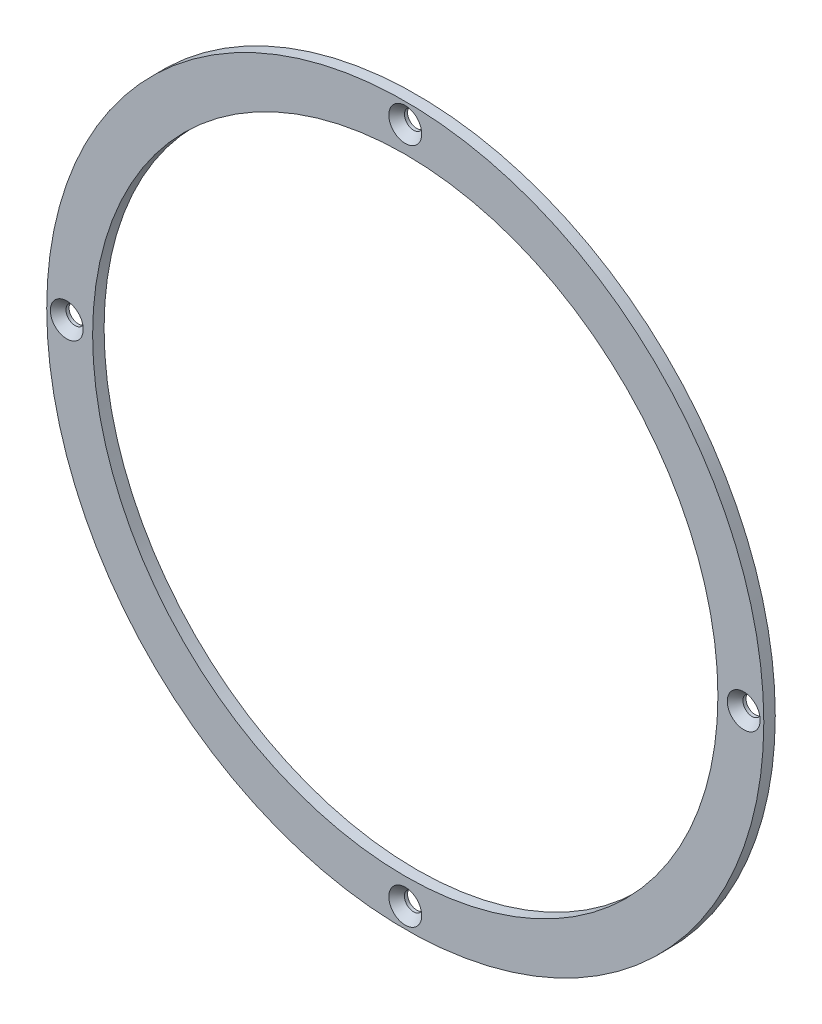
ISO-10303-21;
HEADER;
FILE_DESCRIPTION(('STEP AP214'),'2;1');
FILE_NAME('part.step','',(''),(''),'','','');
FILE_SCHEMA(('AUTOMOTIVE_DESIGN { 1 0 10303 214 1 1 1 1 }'));
ENDSEC;
DATA;
#1=APPLICATION_CONTEXT('core data for automotive mechanical design processes');
#2=APPLICATION_PROTOCOL_DEFINITION('international standard','automotive_design',2000,#1);
#3=PRODUCT_CONTEXT('',#1,'mechanical');
#4=PRODUCT('Part','Part','',(#3));
#5=PRODUCT_RELATED_PRODUCT_CATEGORY('part','',(#4));
#6=PRODUCT_DEFINITION_FORMATION('','',#4);
#7=PRODUCT_DEFINITION_CONTEXT('part definition',#1,'design');
#8=PRODUCT_DEFINITION('design','',#6,#7);
#9=PRODUCT_DEFINITION_SHAPE('','',#8);
#10=(LENGTH_UNIT() NAMED_UNIT(*) SI_UNIT(.MILLI.,.METRE.));
#11=(NAMED_UNIT(*) PLANE_ANGLE_UNIT() SI_UNIT($,.RADIAN.));
#12=(NAMED_UNIT(*) SI_UNIT($,.STERADIAN.) SOLID_ANGLE_UNIT());
#13=UNCERTAINTY_MEASURE_WITH_UNIT(LENGTH_MEASURE(1.E-05),#10,'distance_accuracy_value','');
#14=(GEOMETRIC_REPRESENTATION_CONTEXT(3) GLOBAL_UNCERTAINTY_ASSIGNED_CONTEXT((#13)) GLOBAL_UNIT_ASSIGNED_CONTEXT((#10,
#11,#12)) REPRESENTATION_CONTEXT('',''));
#15=CARTESIAN_POINT('',(0.,0.,0.));
#16=DIRECTION('',(0.,0.,1.));
#17=DIRECTION('',(1.,0.,0.));
#18=AXIS2_PLACEMENT_3D('',#15,#16,#17);
#19=CARTESIAN_POINT('',(44.958,4.70977423727703E-13,1.52399999967656));
#20=DIRECTION('',(0.,0.,1.));
#21=DIRECTION('',(1.,0.,0.));
#22=AXIS2_PLACEMENT_3D('',#19,#20,#21);
#23=CONICAL_SURFACE('',#22,2.18439999975689,0.715584993317592);
#24=CARTESIAN_POINT('',(44.958,4.70977423727703E-13,1.52399999990394));
#25=DIRECTION('',(0.,0.,1.));
#26=DIRECTION('',(1.,0.,0.));
#27=AXIS2_PLACEMENT_3D('',#24,#25,#26);
#28=CIRCLE('',#27,2.18439999995454);
#29=CARTESIAN_POINT('',(47.1423999999545,4.70977423727703E-13,1.52399999990394));
#30=VERTEX_POINT('',#29);
#31=EDGE_CURVE('E18',#30,#30,#28,.F.);
#32=ORIENTED_EDGE('',*,*,#31,.F.);
#33=EDGE_LOOP('',(#32));
#34=FACE_BOUND('',#33,.T.);
#35=CARTESIAN_POINT('',(44.958,4.70910054095129E-13,0.413664413350283));
#36=DIRECTION('',(0.,0.,1.));
#37=DIRECTION('',(1.,0.,0.));
#38=AXIS2_PLACEMENT_3D('',#35,#36,#37);
#39=CIRCLE('',#38,1.2192);
#40=CARTESIAN_POINT('',(46.1772,4.70910054095129E-13,0.413664413350283));
#41=VERTEX_POINT('',#40);
#42=EDGE_CURVE('E33',#41,#41,#39,.F.);
#43=ORIENTED_EDGE('',*,*,#42,.T.);
#44=EDGE_LOOP('',(#43));
#45=FACE_BOUND('',#44,.T.);
#46=ADVANCED_FACE('F15',(#34,#45),#23,.F.);
#47=CARTESIAN_POINT('',(3.13984949151802E-13,-44.958,1.52399999967656));
#48=DIRECTION('',(0.,0.,1.));
#49=DIRECTION('',(1.,0.,0.));
#50=AXIS2_PLACEMENT_3D('',#47,#48,#49);
#51=CONICAL_SURFACE('',#50,2.18439999974831,0.715584993317592);
#52=CARTESIAN_POINT('',(3.13984949151802E-13,-44.958,1.52399999990394));
#53=DIRECTION('',(0.,0.,1.));
#54=DIRECTION('',(1.,0.,0.));
#55=AXIS2_PLACEMENT_3D('',#52,#53,#54);
#56=CIRCLE('',#55,2.18439999994596);
#57=CARTESIAN_POINT('',(2.18439999994627,-44.958,1.52399999990394));
#58=VERTEX_POINT('',#57);
#59=EDGE_CURVE('E62',#58,#58,#56,.F.);
#60=ORIENTED_EDGE('',*,*,#59,.F.);
#61=EDGE_LOOP('',(#60));
#62=FACE_BOUND('',#61,.T.);
#63=CARTESIAN_POINT('',(3.13940036063419E-13,-44.958,0.413664413350283));
#64=DIRECTION('',(0.,0.,1.));
#65=DIRECTION('',(1.,0.,0.));
#66=AXIS2_PLACEMENT_3D('',#63,#64,#65);
#67=CIRCLE('',#66,1.2192);
#68=CARTESIAN_POINT('',(1.21920000000031,-44.958,0.413664413350283));
#69=VERTEX_POINT('',#68);
#70=EDGE_CURVE('E79',#69,#69,#67,.F.);
#71=ORIENTED_EDGE('',*,*,#70,.T.);
#72=EDGE_LOOP('',(#71));
#73=FACE_BOUND('',#72,.T.);
#74=ADVANCED_FACE('F75',(#62,#73),#51,.F.);
#75=CARTESIAN_POINT('',(-44.958,-1.56992474575901E-13,1.52399999967656));
#76=DIRECTION('',(0.,0.,1.));
#77=DIRECTION('',(1.,0.,0.));
#78=AXIS2_PLACEMENT_3D('',#75,#76,#77);
#79=CONICAL_SURFACE('',#78,2.18439999974035,0.715584993317592);
#80=CARTESIAN_POINT('',(-44.958,-1.56992474575901E-13,1.52399999990394));
#81=DIRECTION('',(0.,0.,1.));
#82=DIRECTION('',(1.,0.,0.));
#83=AXIS2_PLACEMENT_3D('',#80,#81,#82);
#84=CIRCLE('',#83,2.184399999938);
#85=CARTESIAN_POINT('',(-42.773600000062,-1.56992474575901E-13,1.52399999990394));
#86=VERTEX_POINT('',#85);
#87=EDGE_CURVE('E60',#86,#86,#84,.F.);
#88=ORIENTED_EDGE('',*,*,#87,.F.);
#89=EDGE_LOOP('',(#88));
#90=FACE_BOUND('',#89,.T.);
#91=CARTESIAN_POINT('',(-44.958,-1.5697001803171E-13,0.413664413350283));
#92=DIRECTION('',(0.,0.,1.));
#93=DIRECTION('',(1.,0.,0.));
#94=AXIS2_PLACEMENT_3D('',#91,#92,#93);
#95=CIRCLE('',#94,1.2192);
#96=CARTESIAN_POINT('',(-43.7388,-1.5697001803171E-13,0.413664413350283));
#97=VERTEX_POINT('',#96);
#98=EDGE_CURVE('E82',#97,#97,#95,.F.);
#99=ORIENTED_EDGE('',*,*,#98,.T.);
#100=EDGE_LOOP('',(#99));
#101=FACE_BOUND('',#100,.T.);
#102=ADVANCED_FACE('F132',(#90,#101),#79,.F.);
#103=CARTESIAN_POINT('',(0.,44.958,1.52399999996078));
#104=DIRECTION('',(0.,0.,1.));
#105=DIRECTION('',(0.,-1.,0.));
#106=AXIS2_PLACEMENT_3D('',#103,#104,#105);
#107=CONICAL_SURFACE('',#106,2.18439999986231,0.715584993313781);
#108=CARTESIAN_POINT('',(0.,44.958,1.52399999996078));
#109=DIRECTION('',(0.,0.,1.));
#110=DIRECTION('',(0.,-1.,0.));
#111=AXIS2_PLACEMENT_3D('',#108,#109,#110);
#112=CIRCLE('',#111,2.18439999986231);
#113=CARTESIAN_POINT('',(0.,42.7736000001377,1.52399999996078));
#114=VERTEX_POINT('',#113);
#115=EDGE_CURVE('E57',#114,#114,#112,.F.);
#116=ORIENTED_EDGE('',*,*,#115,.F.);
#117=EDGE_LOOP('',(#116));
#118=FACE_BOUND('',#117,.T.);
#119=CARTESIAN_POINT('',(0.,44.958,0.413664413350283));
#120=DIRECTION('',(0.,0.,1.));
#121=DIRECTION('',(1.,0.,0.));
#122=AXIS2_PLACEMENT_3D('',#119,#120,#121);
#123=CIRCLE('',#122,1.2192);
#124=CARTESIAN_POINT('',(1.2192,44.958,0.413664413350283));
#125=VERTEX_POINT('',#124);
#126=EDGE_CURVE('E52',#125,#125,#123,.F.);
#127=ORIENTED_EDGE('',*,*,#126,.T.);
#128=EDGE_LOOP('',(#127));
#129=FACE_BOUND('',#128,.T.);
#130=ADVANCED_FACE('F91',(#118,#129),#107,.F.);
#131=CARTESIAN_POINT('',(0.,0.,1.524));
#132=DIRECTION('',(0.,0.,1.));
#133=DIRECTION('',(1.,0.,0.));
#134=AXIS2_PLACEMENT_3D('',#131,#132,#133);
#135=PLANE('',#134);
#136=CARTESIAN_POINT('',(0.,0.,1.524));
#137=DIRECTION('',(0.,0.,-1.));
#138=DIRECTION('',(-1.,0.,0.));
#139=AXIS2_PLACEMENT_3D('',#136,#137,#138);
#140=CIRCLE('',#139,41.529);
#141=CARTESIAN_POINT('',(-41.529,0.,1.524));
#142=VERTEX_POINT('',#141);
#143=EDGE_CURVE('E49',#142,#142,#140,.T.);
#144=ORIENTED_EDGE('',*,*,#143,.T.);
#145=EDGE_LOOP('',(#144));
#146=FACE_BOUND('',#145,.T.);
#147=ORIENTED_EDGE('',*,*,#115,.T.);
#148=EDGE_LOOP('',(#147));
#149=FACE_BOUND('',#148,.T.);
#150=ORIENTED_EDGE('',*,*,#87,.T.);
#151=EDGE_LOOP('',(#150));
#152=FACE_BOUND('',#151,.T.);
#153=ORIENTED_EDGE('',*,*,#59,.T.);
#154=EDGE_LOOP('',(#153));
#155=FACE_BOUND('',#154,.T.);
#156=ORIENTED_EDGE('',*,*,#31,.T.);
#157=EDGE_LOOP('',(#156));
#158=FACE_BOUND('',#157,.T.);
#159=CARTESIAN_POINT('',(0.,0.,1.524));
#160=DIRECTION('',(0.,0.,-1.));
#161=DIRECTION('',(-1.,0.,0.));
#162=AXIS2_PLACEMENT_3D('',#159,#160,#161);
#163=CIRCLE('',#162,47.625);
#164=CARTESIAN_POINT('',(-47.625,0.,1.524));
#165=VERTEX_POINT('',#164);
#166=EDGE_CURVE('E53',#165,#165,#163,.T.);
#167=ORIENTED_EDGE('',*,*,#166,.F.);
#168=EDGE_LOOP('',(#167));
#169=FACE_BOUND('',#168,.T.);
#170=ADVANCED_FACE('F70',(#146,#149,#152,#155,#158,#169),#135,.T.);
#171=CARTESIAN_POINT('',(0.,0.,1.524));
#172=DIRECTION('',(0.,0.,-1.));
#173=DIRECTION('',(-1.,0.,0.));
#174=AXIS2_PLACEMENT_3D('',#171,#172,#173);
#175=CYLINDRICAL_SURFACE('',#174,47.625);
#176=ORIENTED_EDGE('',*,*,#166,.T.);
#177=EDGE_LOOP('',(#176));
#178=FACE_BOUND('',#177,.T.);
#179=CARTESIAN_POINT('',(0.,0.,0.));
#180=DIRECTION('',(0.,0.,-1.));
#181=DIRECTION('',(-1.,0.,0.));
#182=AXIS2_PLACEMENT_3D('',#179,#180,#181);
#183=CIRCLE('',#182,47.625);
#184=CARTESIAN_POINT('',(-47.625,0.,0.));
#185=VERTEX_POINT('',#184);
#186=EDGE_CURVE('E45',#185,#185,#183,.F.);
#187=ORIENTED_EDGE('',*,*,#186,.T.);
#188=EDGE_LOOP('',(#187));
#189=FACE_BOUND('',#188,.T.);
#190=ADVANCED_FACE('F114',(#178,#189),#175,.T.);
#191=CARTESIAN_POINT('',(44.958,4.70910054095129E-13,1.524));
#192=DIRECTION('',(0.,0.,1.));
#193=DIRECTION('',(1.,0.,0.));
#194=AXIS2_PLACEMENT_3D('',#191,#192,#193);
#195=CYLINDRICAL_SURFACE('',#194,1.2192);
#196=ORIENTED_EDGE('',*,*,#42,.F.);
#197=EDGE_LOOP('',(#196));
#198=FACE_BOUND('',#197,.T.);
#199=CARTESIAN_POINT('',(44.958,4.70910054095129E-13,0.));
#200=DIRECTION('',(0.,0.,1.));
#201=DIRECTION('',(1.,0.,0.));
#202=AXIS2_PLACEMENT_3D('',#199,#200,#201);
#203=CIRCLE('',#202,1.2192);
#204=CARTESIAN_POINT('',(46.1772,4.70910054095129E-13,0.));
#205=VERTEX_POINT('',#204);
#206=EDGE_CURVE('E42',#205,#205,#203,.F.);
#207=ORIENTED_EDGE('',*,*,#206,.T.);
#208=EDGE_LOOP('',(#207));
#209=FACE_BOUND('',#208,.T.);
#210=ADVANCED_FACE('F116',(#198,#209),#195,.F.);
#211=CARTESIAN_POINT('',(3.13940036063419E-13,-44.958,1.524));
#212=DIRECTION('',(0.,0.,1.));
#213=DIRECTION('',(1.,0.,0.));
#214=AXIS2_PLACEMENT_3D('',#211,#212,#213);
#215=CYLINDRICAL_SURFACE('',#214,1.2192);
#216=ORIENTED_EDGE('',*,*,#70,.F.);
#217=EDGE_LOOP('',(#216));
#218=FACE_BOUND('',#217,.T.);
#219=CARTESIAN_POINT('',(3.13940036063419E-13,-44.958,0.));
#220=DIRECTION('',(0.,0.,1.));
#221=DIRECTION('',(1.,0.,0.));
#222=AXIS2_PLACEMENT_3D('',#219,#220,#221);
#223=CIRCLE('',#222,1.2192);
#224=CARTESIAN_POINT('',(1.21920000000031,-44.958,0.));
#225=VERTEX_POINT('',#224);
#226=EDGE_CURVE('E38',#225,#225,#223,.F.);
#227=ORIENTED_EDGE('',*,*,#226,.T.);
#228=EDGE_LOOP('',(#227));
#229=FACE_BOUND('',#228,.T.);
#230=ADVANCED_FACE('F124',(#218,#229),#215,.F.);
#231=CARTESIAN_POINT('',(-44.958,-1.5697001803171E-13,1.524));
#232=DIRECTION('',(0.,0.,1.));
#233=DIRECTION('',(1.,0.,0.));
#234=AXIS2_PLACEMENT_3D('',#231,#232,#233);
#235=CYLINDRICAL_SURFACE('',#234,1.2192);
#236=ORIENTED_EDGE('',*,*,#98,.F.);
#237=EDGE_LOOP('',(#236));
#238=FACE_BOUND('',#237,.T.);
#239=CARTESIAN_POINT('',(-44.958,-1.5697001803171E-13,0.));
#240=DIRECTION('',(0.,0.,1.));
#241=DIRECTION('',(1.,0.,0.));
#242=AXIS2_PLACEMENT_3D('',#239,#240,#241);
#243=CIRCLE('',#242,1.2192);
#244=CARTESIAN_POINT('',(-43.7388,-1.5697001803171E-13,0.));
#245=VERTEX_POINT('',#244);
#246=EDGE_CURVE('E30',#245,#245,#243,.F.);
#247=ORIENTED_EDGE('',*,*,#246,.T.);
#248=EDGE_LOOP('',(#247));
#249=FACE_BOUND('',#248,.T.);
#250=ADVANCED_FACE('F97',(#238,#249),#235,.F.);
#251=CARTESIAN_POINT('',(0.,44.958,1.524));
#252=DIRECTION('',(0.,0.,1.));
#253=DIRECTION('',(1.,0.,0.));
#254=AXIS2_PLACEMENT_3D('',#251,#252,#253);
#255=CYLINDRICAL_SURFACE('',#254,1.2192);
#256=ORIENTED_EDGE('',*,*,#126,.F.);
#257=EDGE_LOOP('',(#256));
#258=FACE_BOUND('',#257,.T.);
#259=CARTESIAN_POINT('',(0.,44.958,0.));
#260=DIRECTION('',(0.,0.,1.));
#261=DIRECTION('',(1.,0.,0.));
#262=AXIS2_PLACEMENT_3D('',#259,#260,#261);
#263=CIRCLE('',#262,1.2192);
#264=CARTESIAN_POINT('',(1.2192,44.958,0.));
#265=VERTEX_POINT('',#264);
#266=EDGE_CURVE('E23',#265,#265,#263,.F.);
#267=ORIENTED_EDGE('',*,*,#266,.T.);
#268=EDGE_LOOP('',(#267));
#269=FACE_BOUND('',#268,.T.);
#270=ADVANCED_FACE('F93',(#258,#269),#255,.F.);
#271=CARTESIAN_POINT('',(0.,0.,1.524));
#272=DIRECTION('',(0.,0.,-1.));
#273=DIRECTION('',(-1.,0.,0.));
#274=AXIS2_PLACEMENT_3D('',#271,#272,#273);
#275=CYLINDRICAL_SURFACE('',#274,41.529);
#276=ORIENTED_EDGE('',*,*,#143,.F.);
#277=EDGE_LOOP('',(#276));
#278=FACE_BOUND('',#277,.T.);
#279=CARTESIAN_POINT('',(0.,0.,0.));
#280=DIRECTION('',(0.,0.,-1.));
#281=DIRECTION('',(-1.,0.,0.));
#282=AXIS2_PLACEMENT_3D('',#279,#280,#281);
#283=CIRCLE('',#282,41.529);
#284=CARTESIAN_POINT('',(-41.529,0.,0.));
#285=VERTEX_POINT('',#284);
#286=EDGE_CURVE('E10',#285,#285,#283,.T.);
#287=ORIENTED_EDGE('',*,*,#286,.T.);
#288=EDGE_LOOP('',(#287));
#289=FACE_BOUND('',#288,.T.);
#290=ADVANCED_FACE('F96',(#278,#289),#275,.F.);
#291=CARTESIAN_POINT('',(0.,0.,0.));
#292=DIRECTION('',(0.,0.,1.));
#293=DIRECTION('',(1.,0.,0.));
#294=AXIS2_PLACEMENT_3D('',#291,#292,#293);
#295=PLANE('',#294);
#296=ORIENTED_EDGE('',*,*,#286,.F.);
#297=EDGE_LOOP('',(#296));
#298=FACE_BOUND('',#297,.T.);
#299=ORIENTED_EDGE('',*,*,#266,.F.);
#300=EDGE_LOOP('',(#299));
#301=FACE_BOUND('',#300,.T.);
#302=ORIENTED_EDGE('',*,*,#246,.F.);
#303=EDGE_LOOP('',(#302));
#304=FACE_BOUND('',#303,.T.);
#305=ORIENTED_EDGE('',*,*,#226,.F.);
#306=EDGE_LOOP('',(#305));
#307=FACE_BOUND('',#306,.T.);
#308=ORIENTED_EDGE('',*,*,#206,.F.);
#309=EDGE_LOOP('',(#308));
#310=FACE_BOUND('',#309,.T.);
#311=ORIENTED_EDGE('',*,*,#186,.F.);
#312=EDGE_LOOP('',(#311));
#313=FACE_BOUND('',#312,.T.);
#314=ADVANCED_FACE('F101',(#298,#301,#304,#307,#310,#313),#295,.F.);
#315=CLOSED_SHELL('',(#46,#74,#102,#130,#170,#190,#210,#230,#250,#270,#290,#314));
#316=MANIFOLD_SOLID_BREP('B1',#315);
#317=ADVANCED_BREP_SHAPE_REPRESENTATION('',(#18,#316),#14);
#318=SHAPE_DEFINITION_REPRESENTATION(#9,#317);
ENDSEC;
END-ISO-10303-21;
